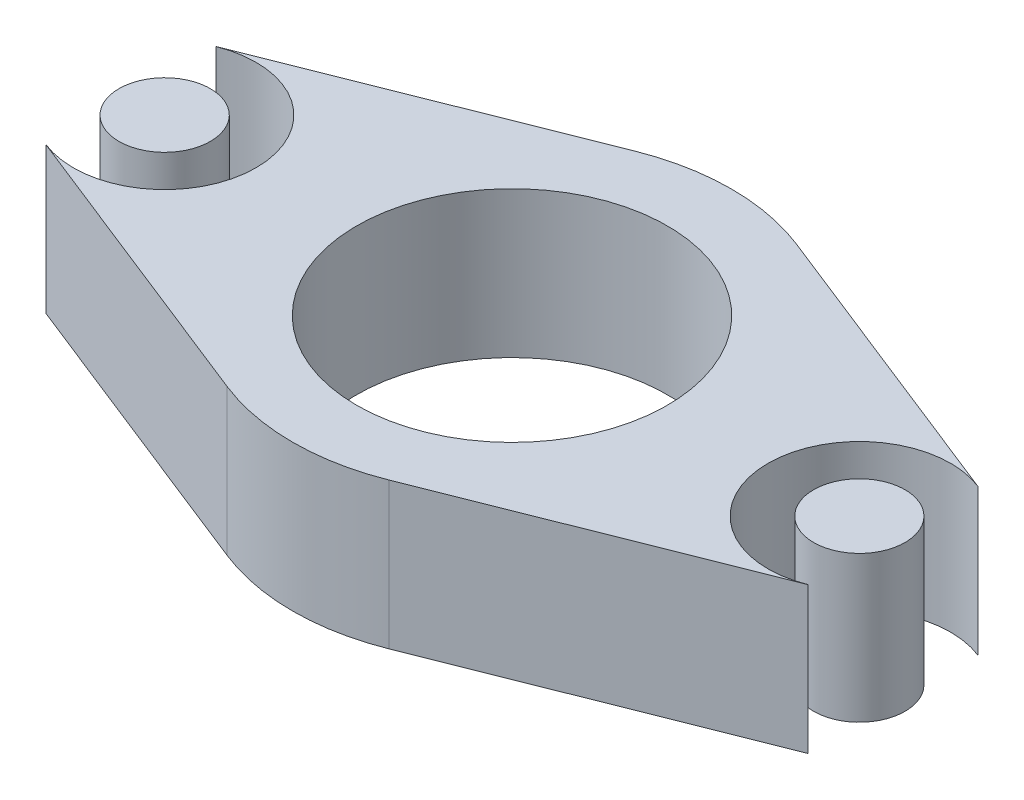
ISO-10303-21;
HEADER;
FILE_DESCRIPTION(('STEP AP214'),'2;1');
FILE_NAME('part.step','',(''),(''),'','','');
FILE_SCHEMA(('AUTOMOTIVE_DESIGN { 1 0 10303 214 1 1 1 1 }'));
ENDSEC;
DATA;
#1=APPLICATION_CONTEXT('core data for automotive mechanical design processes');
#2=APPLICATION_PROTOCOL_DEFINITION('international standard','automotive_design',2000,#1);
#3=PRODUCT_CONTEXT('',#1,'mechanical');
#4=PRODUCT('Part','Part','',(#3));
#5=PRODUCT_RELATED_PRODUCT_CATEGORY('part','',(#4));
#6=PRODUCT_DEFINITION_FORMATION('','',#4);
#7=PRODUCT_DEFINITION_CONTEXT('part definition',#1,'design');
#8=PRODUCT_DEFINITION('design','',#6,#7);
#9=PRODUCT_DEFINITION_SHAPE('','',#8);
#10=(LENGTH_UNIT() NAMED_UNIT(*) SI_UNIT(.MILLI.,.METRE.));
#11=(NAMED_UNIT(*) PLANE_ANGLE_UNIT() SI_UNIT($,.RADIAN.));
#12=(NAMED_UNIT(*) SI_UNIT($,.STERADIAN.) SOLID_ANGLE_UNIT());
#13=UNCERTAINTY_MEASURE_WITH_UNIT(LENGTH_MEASURE(1.E-05),#10,'distance_accuracy_value','');
#14=(GEOMETRIC_REPRESENTATION_CONTEXT(3) GLOBAL_UNCERTAINTY_ASSIGNED_CONTEXT((#13)) GLOBAL_UNIT_ASSIGNED_CONTEXT((#10,
#11,#12)) REPRESENTATION_CONTEXT('',''));
#15=CARTESIAN_POINT('',(0.,0.,0.));
#16=DIRECTION('',(0.,0.,1.));
#17=DIRECTION('',(1.,0.,0.));
#18=AXIS2_PLACEMENT_3D('',#15,#16,#17);
#19=CARTESIAN_POINT('',(-95.,40.,0.));
#20=DIRECTION('',(0.,-1.,0.));
#21=DIRECTION('',(0.,0.,-1.));
#22=AXIS2_PLACEMENT_3D('',#19,#20,#21);
#23=CYLINDRICAL_SURFACE('',#22,12.5);
#24=CARTESIAN_POINT('',(-95.,40.,0.));
#25=DIRECTION('',(0.,1.,0.));
#26=DIRECTION('',(0.,0.,1.));
#27=AXIS2_PLACEMENT_3D('',#24,#25,#26);
#28=CIRCLE('',#27,12.5);
#29=CARTESIAN_POINT('',(-95.,40.,12.5));
#30=VERTEX_POINT('',#29);
#31=EDGE_CURVE('E12',#30,#30,#28,.T.);
#32=ORIENTED_EDGE('',*,*,#31,.F.);
#33=EDGE_LOOP('',(#32));
#34=FACE_BOUND('',#33,.T.);
#35=CARTESIAN_POINT('',(-95.,0.,0.));
#36=DIRECTION('',(0.,1.,0.));
#37=DIRECTION('',(0.,0.,1.));
#38=AXIS2_PLACEMENT_3D('',#35,#36,#37);
#39=CIRCLE('',#38,12.5);
#40=CARTESIAN_POINT('',(-95.,0.,12.5));
#41=VERTEX_POINT('',#40);
#42=EDGE_CURVE('E111',#41,#41,#39,.T.);
#43=ORIENTED_EDGE('',*,*,#42,.T.);
#44=EDGE_LOOP('',(#43));
#45=FACE_BOUND('',#44,.T.);
#46=ADVANCED_FACE('F108',(#34,#45),#23,.T.);
#47=CARTESIAN_POINT('',(0.,40.,0.));
#48=DIRECTION('',(0.,1.,0.));
#49=DIRECTION('',(0.,0.,1.));
#50=AXIS2_PLACEMENT_3D('',#47,#48,#49);
#51=PLANE('',#50);
#52=ORIENTED_EDGE('',*,*,#31,.T.);
#53=EDGE_LOOP('',(#52));
#54=FACE_BOUND('',#53,.T.);
#55=ADVANCED_FACE('F123',(#54),#51,.T.);
#56=CARTESIAN_POINT('',(0.,0.,0.));
#57=DIRECTION('',(0.,1.,0.));
#58=DIRECTION('',(0.,0.,1.));
#59=AXIS2_PLACEMENT_3D('',#56,#57,#58);
#60=PLANE('',#59);
#61=ORIENTED_EDGE('',*,*,#42,.F.);
#62=EDGE_LOOP('',(#61));
#63=FACE_BOUND('',#62,.T.);
#64=ADVANCED_FACE('F121',(#63),#60,.F.);
#65=CLOSED_SHELL('',(#46,#55,#64));
#66=MANIFOLD_SOLID_BREP('B2',#65);
#67=CARTESIAN_POINT('',(95.,40.,0.));
#68=DIRECTION('',(0.,-1.,0.));
#69=DIRECTION('',(0.,0.,-1.));
#70=AXIS2_PLACEMENT_3D('',#67,#68,#69);
#71=CYLINDRICAL_SURFACE('',#70,12.5);
#72=CARTESIAN_POINT('',(95.,40.,0.));
#73=DIRECTION('',(0.,1.,0.));
#74=DIRECTION('',(0.,0.,1.));
#75=AXIS2_PLACEMENT_3D('',#72,#73,#74);
#76=CIRCLE('',#75,12.5);
#77=CARTESIAN_POINT('',(95.,40.,12.5));
#78=VERTEX_POINT('',#77);
#79=EDGE_CURVE('E107',#78,#78,#76,.F.);
#80=ORIENTED_EDGE('',*,*,#79,.T.);
#81=EDGE_LOOP('',(#80));
#82=FACE_BOUND('',#81,.T.);
#83=CARTESIAN_POINT('',(95.,0.,0.));
#84=DIRECTION('',(0.,1.,0.));
#85=DIRECTION('',(0.,0.,1.));
#86=AXIS2_PLACEMENT_3D('',#83,#84,#85);
#87=CIRCLE('',#86,12.5);
#88=CARTESIAN_POINT('',(95.,0.,12.5));
#89=VERTEX_POINT('',#88);
#90=EDGE_CURVE('E161',#89,#89,#87,.F.);
#91=ORIENTED_EDGE('',*,*,#90,.F.);
#92=EDGE_LOOP('',(#91));
#93=FACE_BOUND('',#92,.T.);
#94=ADVANCED_FACE('F158',(#82,#93),#71,.T.);
#95=CARTESIAN_POINT('',(0.,40.,0.));
#96=DIRECTION('',(0.,1.,0.));
#97=DIRECTION('',(0.,0.,1.));
#98=AXIS2_PLACEMENT_3D('',#95,#96,#97);
#99=PLANE('',#98);
#100=ORIENTED_EDGE('',*,*,#79,.F.);
#101=EDGE_LOOP('',(#100));
#102=FACE_BOUND('',#101,.T.);
#103=ADVANCED_FACE('F173',(#102),#99,.T.);
#104=CARTESIAN_POINT('',(0.,0.,0.));
#105=DIRECTION('',(0.,1.,0.));
#106=DIRECTION('',(0.,0.,1.));
#107=AXIS2_PLACEMENT_3D('',#104,#105,#106);
#108=PLANE('',#107);
#109=ORIENTED_EDGE('',*,*,#90,.T.);
#110=EDGE_LOOP('',(#109));
#111=FACE_BOUND('',#110,.T.);
#112=ADVANCED_FACE('F170',(#111),#108,.F.);
#113=CLOSED_SHELL('',(#94,#103,#112));
#114=MANIFOLD_SOLID_BREP('B7',#113);
#115=CARTESIAN_POINT('',(-95.,40.,0.));
#116=DIRECTION('',(0.,-1.,0.));
#117=DIRECTION('',(0.,0.,-1.));
#118=AXIS2_PLACEMENT_3D('',#115,#116,#117);
#119=CYLINDRICAL_SURFACE('',#118,25.);
#120=CARTESIAN_POINT('',(-95.,0.,0.));
#121=DIRECTION('',(0.,1.,0.));
#122=DIRECTION('',(0.,0.,1.));
#123=AXIS2_PLACEMENT_3D('',#120,#121,#122);
#124=CIRCLE('',#123,25.);
#125=CARTESIAN_POINT('',(-104.210526315789,0.,23.2414759640206));
#126=VERTEX_POINT('',#125);
#127=CARTESIAN_POINT('',(-104.210526315789,0.,-23.2414759640207));
#128=VERTEX_POINT('',#127);
#129=EDGE_CURVE('E304',#126,#128,#124,.T.);
#130=ORIENTED_EDGE('',*,*,#129,.F.);
#131=DIRECTION('',(0.,-1.,0.));
#132=VECTOR('',#131,1.);
#133=CARTESIAN_POINT('',(-104.210526315789,40.,23.2414759640206));
#134=LINE('',#133,#132);
#135=CARTESIAN_POINT('',(-104.210526315789,40.,23.2414759640206));
#136=VERTEX_POINT('',#135);
#137=EDGE_CURVE('E156',#136,#126,#134,.T.);
#138=ORIENTED_EDGE('',*,*,#137,.F.);
#139=CARTESIAN_POINT('',(-95.,40.,0.));
#140=DIRECTION('',(0.,1.,0.));
#141=DIRECTION('',(0.,0.,1.));
#142=AXIS2_PLACEMENT_3D('',#139,#140,#141);
#143=CIRCLE('',#142,25.);
#144=CARTESIAN_POINT('',(-104.210526315789,40.,-23.2414759640207));
#145=VERTEX_POINT('',#144);
#146=EDGE_CURVE('E331',#136,#145,#143,.T.);
#147=ORIENTED_EDGE('',*,*,#146,.T.);
#148=DIRECTION('',(0.,-1.,0.));
#149=VECTOR('',#148,1.);
#150=CARTESIAN_POINT('',(-104.210526315789,40.,-23.2414759640207));
#151=LINE('',#150,#149);
#152=EDGE_CURVE('E250',#145,#128,#151,.T.);
#153=ORIENTED_EDGE('',*,*,#152,.T.);
#154=EDGE_LOOP('',(#130,#138,#147,#153));
#155=FACE_BOUND('',#154,.T.);
#156=ADVANCED_FACE('F199',(#155),#119,.F.);
#157=CARTESIAN_POINT('',(-22.1052631578947,40.,55.7795423136496));
#158=DIRECTION('',(-0.368421052631579,0.,0.929659038560826));
#159=DIRECTION('',(0.929659038560826,0.,0.368421052631579));
#160=AXIS2_PLACEMENT_3D('',#157,#158,#159);
#161=PLANE('',#160);
#162=DIRECTION('',(-0.929659038560826,0.,-0.368421052631579));
#163=VECTOR('',#162,1.);
#164=CARTESIAN_POINT('',(-22.1052631578947,0.,55.7795423136496));
#165=LINE('',#164,#163);
#166=CARTESIAN_POINT('',(-22.1052631578947,0.,55.7795423136496));
#167=VERTEX_POINT('',#166);
#168=EDGE_CURVE('E308',#167,#126,#165,.T.);
#169=ORIENTED_EDGE('',*,*,#168,.F.);
#170=DIRECTION('',(0.,-1.,0.));
#171=VECTOR('',#170,1.);
#172=CARTESIAN_POINT('',(-22.1052631578947,40.,55.7795423136496));
#173=LINE('',#172,#171);
#174=CARTESIAN_POINT('',(-22.1052631578947,40.,55.7795423136496));
#175=VERTEX_POINT('',#174);
#176=EDGE_CURVE('E208',#175,#167,#173,.T.);
#177=ORIENTED_EDGE('',*,*,#176,.F.);
#178=DIRECTION('',(-0.929659038560826,0.,-0.368421052631579));
#179=VECTOR('',#178,1.);
#180=CARTESIAN_POINT('',(-22.1052631578947,40.,55.7795423136496));
#181=LINE('',#180,#179);
#182=EDGE_CURVE('E361',#175,#136,#181,.T.);
#183=ORIENTED_EDGE('',*,*,#182,.T.);
#184=ORIENTED_EDGE('',*,*,#137,.T.);
#185=EDGE_LOOP('',(#169,#177,#183,#184));
#186=FACE_BOUND('',#185,.T.);
#187=ADVANCED_FACE('F360',(#186),#161,.T.);
#188=CARTESIAN_POINT('',(0.,40.,0.));
#189=DIRECTION('',(0.,-1.,0.));
#190=DIRECTION('',(0.,0.,-1.));
#191=AXIS2_PLACEMENT_3D('',#188,#189,#190);
#192=CYLINDRICAL_SURFACE('',#191,60.);
#193=CARTESIAN_POINT('',(0.,0.,0.));
#194=DIRECTION('',(0.,1.,0.));
#195=DIRECTION('',(0.,0.,1.));
#196=AXIS2_PLACEMENT_3D('',#193,#194,#195);
#197=CIRCLE('',#196,60.);
#198=CARTESIAN_POINT('',(22.1052631578947,0.,55.7795423136496));
#199=VERTEX_POINT('',#198);
#200=EDGE_CURVE('E312',#167,#199,#197,.T.);
#201=ORIENTED_EDGE('',*,*,#200,.T.);
#202=DIRECTION('',(0.,-1.,0.));
#203=VECTOR('',#202,1.);
#204=CARTESIAN_POINT('',(22.1052631578947,40.,55.7795423136496));
#205=LINE('',#204,#203);
#206=CARTESIAN_POINT('',(22.1052631578947,40.,55.7795423136496));
#207=VERTEX_POINT('',#206);
#208=EDGE_CURVE('E342',#207,#199,#205,.T.);
#209=ORIENTED_EDGE('',*,*,#208,.F.);
#210=CARTESIAN_POINT('',(0.,40.,0.));
#211=DIRECTION('',(0.,1.,0.));
#212=DIRECTION('',(0.,0.,1.));
#213=AXIS2_PLACEMENT_3D('',#210,#211,#212);
#214=CIRCLE('',#213,60.);
#215=EDGE_CURVE('E285',#175,#207,#214,.T.);
#216=ORIENTED_EDGE('',*,*,#215,.F.);
#217=ORIENTED_EDGE('',*,*,#176,.T.);
#218=EDGE_LOOP('',(#201,#209,#216,#217));
#219=FACE_BOUND('',#218,.T.);
#220=ADVANCED_FACE('F349',(#219),#192,.T.);
#221=CARTESIAN_POINT('',(22.1052631578947,40.,55.7795423136496));
#222=DIRECTION('',(-0.368421052631579,0.,-0.929659038560826));
#223=DIRECTION('',(-0.929659038560826,0.,0.368421052631579));
#224=AXIS2_PLACEMENT_3D('',#221,#222,#223);
#225=PLANE('',#224);
#226=DIRECTION('',(0.929659038560826,0.,-0.368421052631579));
#227=VECTOR('',#226,1.);
#228=CARTESIAN_POINT('',(22.1052631578947,0.,55.7795423136496));
#229=LINE('',#228,#227);
#230=CARTESIAN_POINT('',(104.210526315789,0.,23.2414759640206));
#231=VERTEX_POINT('',#230);
#232=EDGE_CURVE('E315',#199,#231,#229,.T.);
#233=ORIENTED_EDGE('',*,*,#232,.T.);
#234=DIRECTION('',(0.,-1.,0.));
#235=VECTOR('',#234,1.);
#236=CARTESIAN_POINT('',(104.210526315789,40.,23.2414759640206));
#237=LINE('',#236,#235);
#238=CARTESIAN_POINT('',(104.210526315789,40.,23.2414759640206));
#239=VERTEX_POINT('',#238);
#240=EDGE_CURVE('E338',#239,#231,#237,.T.);
#241=ORIENTED_EDGE('',*,*,#240,.F.);
#242=DIRECTION('',(0.929659038560826,0.,-0.368421052631579));
#243=VECTOR('',#242,1.);
#244=CARTESIAN_POINT('',(22.1052631578947,40.,55.7795423136496));
#245=LINE('',#244,#243);
#246=EDGE_CURVE('E294',#207,#239,#245,.T.);
#247=ORIENTED_EDGE('',*,*,#246,.F.);
#248=ORIENTED_EDGE('',*,*,#208,.T.);
#249=EDGE_LOOP('',(#233,#241,#247,#248));
#250=FACE_BOUND('',#249,.T.);
#251=ADVANCED_FACE('F374',(#250),#225,.F.);
#252=CARTESIAN_POINT('',(95.,40.,0.));
#253=DIRECTION('',(0.,-1.,0.));
#254=DIRECTION('',(0.,0.,-1.));
#255=AXIS2_PLACEMENT_3D('',#252,#253,#254);
#256=CYLINDRICAL_SURFACE('',#255,25.);
#257=CARTESIAN_POINT('',(95.,0.,0.));
#258=DIRECTION('',(0.,1.,0.));
#259=DIRECTION('',(0.,0.,1.));
#260=AXIS2_PLACEMENT_3D('',#257,#258,#259);
#261=CIRCLE('',#260,25.);
#262=CARTESIAN_POINT('',(104.210526315789,0.,-23.2414759640207));
#263=VERTEX_POINT('',#262);
#264=EDGE_CURVE('E318',#231,#263,#261,.F.);
#265=ORIENTED_EDGE('',*,*,#264,.T.);
#266=DIRECTION('',(0.,-1.,0.));
#267=VECTOR('',#266,1.);
#268=CARTESIAN_POINT('',(104.210526315789,40.,-23.2414759640207));
#269=LINE('',#268,#267);
#270=CARTESIAN_POINT('',(104.210526315789,40.,-23.2414759640207));
#271=VERTEX_POINT('',#270);
#272=EDGE_CURVE('E278',#271,#263,#269,.T.);
#273=ORIENTED_EDGE('',*,*,#272,.F.);
#274=CARTESIAN_POINT('',(95.,40.,0.));
#275=DIRECTION('',(0.,1.,0.));
#276=DIRECTION('',(0.,0.,1.));
#277=AXIS2_PLACEMENT_3D('',#274,#275,#276);
#278=CIRCLE('',#277,25.);
#279=EDGE_CURVE('E289',#239,#271,#278,.F.);
#280=ORIENTED_EDGE('',*,*,#279,.F.);
#281=ORIENTED_EDGE('',*,*,#240,.T.);
#282=EDGE_LOOP('',(#265,#273,#280,#281));
#283=FACE_BOUND('',#282,.T.);
#284=ADVANCED_FACE('F376',(#283),#256,.F.);
#285=CARTESIAN_POINT('',(22.1052631578947,40.,-55.7795423136496));
#286=DIRECTION('',(0.368421052631579,0.,-0.929659038560826));
#287=DIRECTION('',(-0.929659038560826,0.,-0.368421052631579));
#288=AXIS2_PLACEMENT_3D('',#285,#286,#287);
#289=PLANE('',#288);
#290=DIRECTION('',(0.929659038560826,0.,0.368421052631579));
#291=VECTOR('',#290,1.);
#292=CARTESIAN_POINT('',(22.1052631578947,0.,-55.7795423136496));
#293=LINE('',#292,#291);
#294=CARTESIAN_POINT('',(22.1052631578947,0.,-55.7795423136496));
#295=VERTEX_POINT('',#294);
#296=EDGE_CURVE('E276',#295,#263,#293,.T.);
#297=ORIENTED_EDGE('',*,*,#296,.F.);
#298=DIRECTION('',(0.,-1.,0.));
#299=VECTOR('',#298,1.);
#300=CARTESIAN_POINT('',(22.1052631578947,40.,-55.7795423136496));
#301=LINE('',#300,#299);
#302=CARTESIAN_POINT('',(22.1052631578947,40.,-55.7795423136496));
#303=VERTEX_POINT('',#302);
#304=EDGE_CURVE('E270',#303,#295,#301,.T.);
#305=ORIENTED_EDGE('',*,*,#304,.F.);
#306=DIRECTION('',(0.929659038560826,0.,0.368421052631579));
#307=VECTOR('',#306,1.);
#308=CARTESIAN_POINT('',(22.1052631578947,40.,-55.7795423136496));
#309=LINE('',#308,#307);
#310=EDGE_CURVE('E274',#303,#271,#309,.T.);
#311=ORIENTED_EDGE('',*,*,#310,.T.);
#312=ORIENTED_EDGE('',*,*,#272,.T.);
#313=EDGE_LOOP('',(#297,#305,#311,#312));
#314=FACE_BOUND('',#313,.T.);
#315=ADVANCED_FACE('F272',(#314),#289,.T.);
#316=CARTESIAN_POINT('',(-22.1052631578947,0.,-55.7795423136496));
#317=VERTEX_POINT('',#316);
#318=EDGE_CURVE('E243',#295,#317,#197,.T.);
#319=ORIENTED_EDGE('',*,*,#318,.T.);
#320=DIRECTION('',(0.,-1.,0.));
#321=VECTOR('',#320,1.);
#322=CARTESIAN_POINT('',(-22.1052631578947,40.,-55.7795423136496));
#323=LINE('',#322,#321);
#324=CARTESIAN_POINT('',(-22.1052631578947,40.,-55.7795423136496));
#325=VERTEX_POINT('',#324);
#326=EDGE_CURVE('E279',#325,#317,#323,.T.);
#327=ORIENTED_EDGE('',*,*,#326,.F.);
#328=EDGE_CURVE('E281',#303,#325,#214,.T.);
#329=ORIENTED_EDGE('',*,*,#328,.F.);
#330=ORIENTED_EDGE('',*,*,#304,.T.);
#331=EDGE_LOOP('',(#319,#327,#329,#330));
#332=FACE_BOUND('',#331,.T.);
#333=ADVANCED_FACE('F282',(#332),#192,.T.);
#334=CARTESIAN_POINT('',(-22.1052631578947,40.,-55.7795423136496));
#335=DIRECTION('',(0.368421052631579,0.,0.929659038560826));
#336=DIRECTION('',(0.929659038560826,0.,-0.368421052631579));
#337=AXIS2_PLACEMENT_3D('',#334,#335,#336);
#338=PLANE('',#337);
#339=DIRECTION('',(-0.929659038560826,0.,0.368421052631579));
#340=VECTOR('',#339,1.);
#341=CARTESIAN_POINT('',(-22.1052631578947,0.,-55.7795423136496));
#342=LINE('',#341,#340);
#343=EDGE_CURVE('E324',#317,#128,#342,.T.);
#344=ORIENTED_EDGE('',*,*,#343,.T.);
#345=ORIENTED_EDGE('',*,*,#152,.F.);
#346=DIRECTION('',(-0.929659038560826,0.,0.368421052631579));
#347=VECTOR('',#346,1.);
#348=CARTESIAN_POINT('',(-22.1052631578947,40.,-55.7795423136496));
#349=LINE('',#348,#347);
#350=EDGE_CURVE('E216',#325,#145,#349,.T.);
#351=ORIENTED_EDGE('',*,*,#350,.F.);
#352=ORIENTED_EDGE('',*,*,#326,.T.);
#353=EDGE_LOOP('',(#344,#345,#351,#352));
#354=FACE_BOUND('',#353,.T.);
#355=ADVANCED_FACE('F364',(#354),#338,.F.);
#356=CARTESIAN_POINT('',(0.,40.,0.));
#357=DIRECTION('',(0.,-1.,0.));
#358=DIRECTION('',(0.,0.,-1.));
#359=AXIS2_PLACEMENT_3D('',#356,#357,#358);
#360=CYLINDRICAL_SURFACE('',#359,42.5);
#361=CARTESIAN_POINT('',(0.,40.,0.));
#362=DIRECTION('',(0.,1.,0.));
#363=DIRECTION('',(0.,0.,1.));
#364=AXIS2_PLACEMENT_3D('',#361,#362,#363);
#365=CIRCLE('',#364,42.5);
#366=CARTESIAN_POINT('',(0.,40.,42.5));
#367=VERTEX_POINT('',#366);
#368=EDGE_CURVE('E300',#367,#367,#365,.T.);
#369=ORIENTED_EDGE('',*,*,#368,.T.);
#370=EDGE_LOOP('',(#369));
#371=FACE_BOUND('',#370,.T.);
#372=CARTESIAN_POINT('',(0.,0.,0.));
#373=DIRECTION('',(0.,1.,0.));
#374=DIRECTION('',(0.,0.,1.));
#375=AXIS2_PLACEMENT_3D('',#372,#373,#374);
#376=CIRCLE('',#375,42.5);
#377=CARTESIAN_POINT('',(0.,0.,42.5));
#378=VERTEX_POINT('',#377);
#379=EDGE_CURVE('E327',#378,#378,#376,.T.);
#380=ORIENTED_EDGE('',*,*,#379,.F.);
#381=EDGE_LOOP('',(#380));
#382=FACE_BOUND('',#381,.T.);
#383=ADVANCED_FACE('F400',(#371,#382),#360,.F.);
#384=CARTESIAN_POINT('',(0.,40.,0.));
#385=DIRECTION('',(0.,1.,0.));
#386=DIRECTION('',(0.,0.,1.));
#387=AXIS2_PLACEMENT_3D('',#384,#385,#386);
#388=PLANE('',#387);
#389=ORIENTED_EDGE('',*,*,#146,.F.);
#390=ORIENTED_EDGE('',*,*,#182,.F.);
#391=ORIENTED_EDGE('',*,*,#215,.T.);
#392=ORIENTED_EDGE('',*,*,#246,.T.);
#393=ORIENTED_EDGE('',*,*,#279,.T.);
#394=ORIENTED_EDGE('',*,*,#310,.F.);
#395=ORIENTED_EDGE('',*,*,#328,.T.);
#396=ORIENTED_EDGE('',*,*,#350,.T.);
#397=EDGE_LOOP('',(#389,#390,#391,#392,#393,#394,#395,#396));
#398=FACE_BOUND('',#397,.T.);
#399=ORIENTED_EDGE('',*,*,#368,.F.);
#400=EDGE_LOOP('',(#399));
#401=FACE_BOUND('',#400,.T.);
#402=ADVANCED_FACE('F286',(#398,#401),#388,.T.);
#403=CARTESIAN_POINT('',(0.,0.,0.));
#404=DIRECTION('',(0.,1.,0.));
#405=DIRECTION('',(0.,0.,1.));
#406=AXIS2_PLACEMENT_3D('',#403,#404,#405);
#407=PLANE('',#406);
#408=ORIENTED_EDGE('',*,*,#129,.T.);
#409=ORIENTED_EDGE('',*,*,#343,.F.);
#410=ORIENTED_EDGE('',*,*,#318,.F.);
#411=ORIENTED_EDGE('',*,*,#296,.T.);
#412=ORIENTED_EDGE('',*,*,#264,.F.);
#413=ORIENTED_EDGE('',*,*,#232,.F.);
#414=ORIENTED_EDGE('',*,*,#200,.F.);
#415=ORIENTED_EDGE('',*,*,#168,.T.);
#416=EDGE_LOOP('',(#408,#409,#410,#411,#412,#413,#414,#415));
#417=FACE_BOUND('',#416,.T.);
#418=ORIENTED_EDGE('',*,*,#379,.T.);
#419=EDGE_LOOP('',(#418));
#420=FACE_BOUND('',#419,.T.);
#421=ADVANCED_FACE('F357',(#417,#420),#407,.F.);
#422=CLOSED_SHELL('',(#156,#187,#220,#251,#284,#315,#333,#355,#383,#402,#421));
#423=MANIFOLD_SOLID_BREP('B102',#422);
#424=ADVANCED_BREP_SHAPE_REPRESENTATION('',(#18,#66,#114,#423),#14);
#425=SHAPE_DEFINITION_REPRESENTATION(#9,#424);
ENDSEC;
END-ISO-10303-21;
